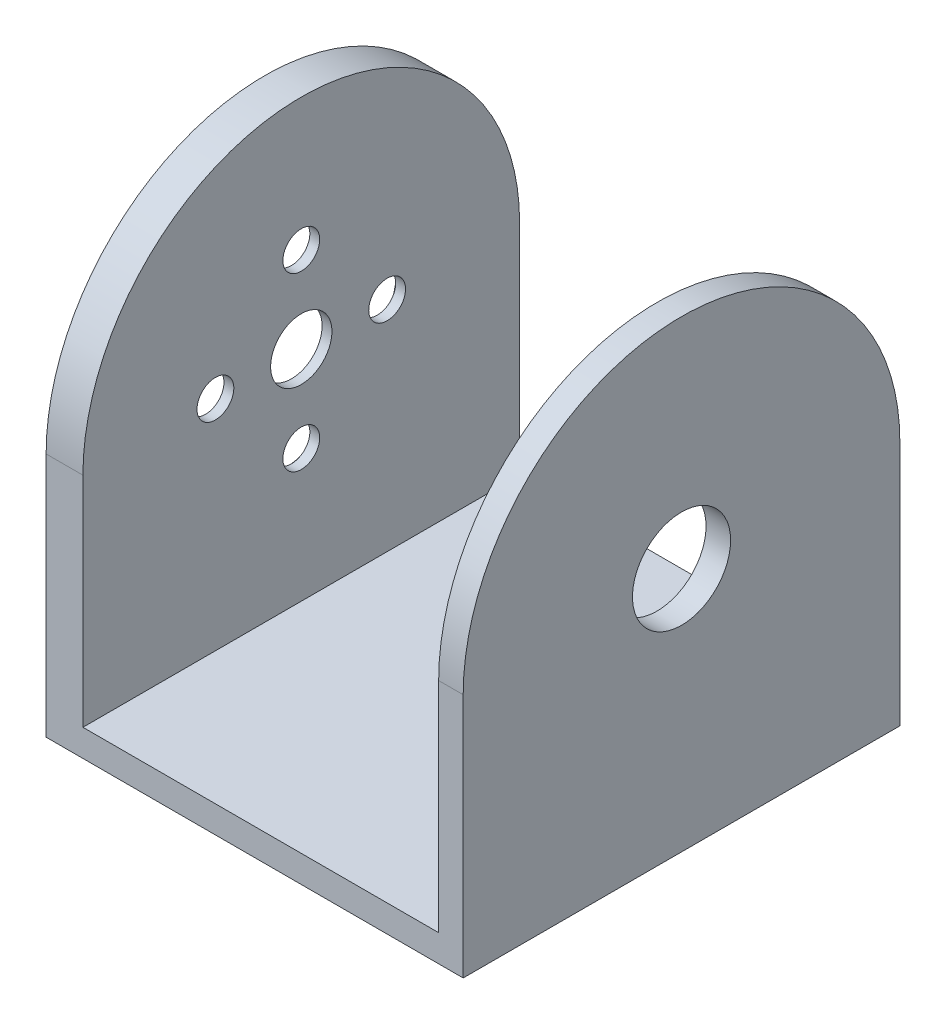
ISO-10303-21;
HEADER;
FILE_DESCRIPTION(('STEP AP214'),'2;1');
FILE_NAME('part.step','',(''),(''),'','','');
FILE_SCHEMA(('AUTOMOTIVE_DESIGN { 1 0 10303 214 1 1 1 1 }'));
ENDSEC;
DATA;
#1=APPLICATION_CONTEXT('core data for automotive mechanical design processes');
#2=APPLICATION_PROTOCOL_DEFINITION('international standard','automotive_design',2000,#1);
#3=PRODUCT_CONTEXT('',#1,'mechanical');
#4=PRODUCT('Part','Part','',(#3));
#5=PRODUCT_RELATED_PRODUCT_CATEGORY('part','',(#4));
#6=PRODUCT_DEFINITION_FORMATION('','',#4);
#7=PRODUCT_DEFINITION_CONTEXT('part definition',#1,'design');
#8=PRODUCT_DEFINITION('design','',#6,#7);
#9=PRODUCT_DEFINITION_SHAPE('','',#8);
#10=(LENGTH_UNIT() NAMED_UNIT(*) SI_UNIT(.MILLI.,.METRE.));
#11=(NAMED_UNIT(*) PLANE_ANGLE_UNIT() SI_UNIT($,.RADIAN.));
#12=(NAMED_UNIT(*) SI_UNIT($,.STERADIAN.) SOLID_ANGLE_UNIT());
#13=UNCERTAINTY_MEASURE_WITH_UNIT(LENGTH_MEASURE(1.E-05),#10,'distance_accuracy_value','');
#14=(GEOMETRIC_REPRESENTATION_CONTEXT(3) GLOBAL_UNCERTAINTY_ASSIGNED_CONTEXT((#13)) GLOBAL_UNIT_ASSIGNED_CONTEXT((#10,
#11,#12)) REPRESENTATION_CONTEXT('',''));
#15=CARTESIAN_POINT('',(0.,0.,0.));
#16=DIRECTION('',(0.,0.,1.));
#17=DIRECTION('',(1.,0.,0.));
#18=AXIS2_PLACEMENT_3D('',#15,#16,#17);
#19=CARTESIAN_POINT('',(-4.99999999999999,20.,0.));
#20=DIRECTION('',(-1.,0.,0.));
#21=DIRECTION('',(0.,0.,1.));
#22=AXIS2_PLACEMENT_3D('',#19,#20,#21);
#23=CYLINDRICAL_SURFACE('',#22,2.5);
#24=CARTESIAN_POINT('',(-14.,20.,0.));
#25=DIRECTION('',(-1.,0.,0.));
#26=DIRECTION('',(0.,0.,1.));
#27=AXIS2_PLACEMENT_3D('',#24,#25,#26);
#28=CIRCLE('',#27,2.5);
#29=CARTESIAN_POINT('',(-14.,20.,2.5));
#30=VERTEX_POINT('',#29);
#31=EDGE_CURVE('E205',#30,#30,#28,.T.);
#32=ORIENTED_EDGE('',*,*,#31,.F.);
#33=EDGE_LOOP('',(#32));
#34=FACE_BOUND('',#33,.T.);
#35=CARTESIAN_POINT('',(-14.8,20.,0.));
#36=DIRECTION('',(-1.,0.,0.));
#37=DIRECTION('',(0.,0.,1.));
#38=AXIS2_PLACEMENT_3D('',#35,#36,#37);
#39=CIRCLE('',#38,2.5);
#40=CARTESIAN_POINT('',(-14.8,20.,2.5));
#41=VERTEX_POINT('',#40);
#42=EDGE_CURVE('E240',#41,#41,#39,.T.);
#43=ORIENTED_EDGE('',*,*,#42,.T.);
#44=EDGE_LOOP('',(#43));
#45=FACE_BOUND('',#44,.T.);
#46=ADVANCED_FACE('F45',(#34,#45),#23,.F.);
#47=CARTESIAN_POINT('',(-4.99999999999999,13.,0.));
#48=DIRECTION('',(-1.,0.,0.));
#49=DIRECTION('',(0.,0.,1.));
#50=AXIS2_PLACEMENT_3D('',#47,#48,#49);
#51=CYLINDRICAL_SURFACE('',#50,1.5);
#52=CARTESIAN_POINT('',(-14.,13.,0.));
#53=DIRECTION('',(-1.,0.,0.));
#54=DIRECTION('',(0.,0.,1.));
#55=AXIS2_PLACEMENT_3D('',#52,#53,#54);
#56=CIRCLE('',#55,1.5);
#57=CARTESIAN_POINT('',(-14.,13.,1.5));
#58=VERTEX_POINT('',#57);
#59=EDGE_CURVE('E209',#58,#58,#56,.T.);
#60=ORIENTED_EDGE('',*,*,#59,.F.);
#61=EDGE_LOOP('',(#60));
#62=FACE_BOUND('',#61,.T.);
#63=CARTESIAN_POINT('',(-14.8,13.,0.));
#64=DIRECTION('',(-1.,0.,0.));
#65=DIRECTION('',(0.,0.,1.));
#66=AXIS2_PLACEMENT_3D('',#63,#64,#65);
#67=CIRCLE('',#66,1.5);
#68=CARTESIAN_POINT('',(-14.8,13.,1.5));
#69=VERTEX_POINT('',#68);
#70=EDGE_CURVE('E245',#69,#69,#67,.T.);
#71=ORIENTED_EDGE('',*,*,#70,.T.);
#72=EDGE_LOOP('',(#71));
#73=FACE_BOUND('',#72,.T.);
#74=ADVANCED_FACE('F297',(#62,#73),#51,.F.);
#75=CARTESIAN_POINT('',(-4.99999999999999,20.,-7.));
#76=DIRECTION('',(-1.,0.,0.));
#77=DIRECTION('',(0.,0.,1.));
#78=AXIS2_PLACEMENT_3D('',#75,#76,#77);
#79=CYLINDRICAL_SURFACE('',#78,1.5);
#80=CARTESIAN_POINT('',(-14.,20.,-7.));
#81=DIRECTION('',(-1.,0.,0.));
#82=DIRECTION('',(0.,0.,1.));
#83=AXIS2_PLACEMENT_3D('',#80,#81,#82);
#84=CIRCLE('',#83,1.5);
#85=CARTESIAN_POINT('',(-14.,20.,-5.5));
#86=VERTEX_POINT('',#85);
#87=EDGE_CURVE('E214',#86,#86,#84,.T.);
#88=ORIENTED_EDGE('',*,*,#87,.F.);
#89=EDGE_LOOP('',(#88));
#90=FACE_BOUND('',#89,.T.);
#91=CARTESIAN_POINT('',(-14.8,20.,-7.));
#92=DIRECTION('',(-1.,0.,0.));
#93=DIRECTION('',(0.,0.,1.));
#94=AXIS2_PLACEMENT_3D('',#91,#92,#93);
#95=CIRCLE('',#94,1.5);
#96=CARTESIAN_POINT('',(-14.8,20.,-5.5));
#97=VERTEX_POINT('',#96);
#98=EDGE_CURVE('E239',#97,#97,#95,.T.);
#99=ORIENTED_EDGE('',*,*,#98,.T.);
#100=EDGE_LOOP('',(#99));
#101=FACE_BOUND('',#100,.T.);
#102=ADVANCED_FACE('F303',(#90,#101),#79,.F.);
#103=CARTESIAN_POINT('',(-4.99999999999999,27.,0.));
#104=DIRECTION('',(-1.,0.,0.));
#105=DIRECTION('',(0.,0.,1.));
#106=AXIS2_PLACEMENT_3D('',#103,#104,#105);
#107=CYLINDRICAL_SURFACE('',#106,1.5);
#108=CARTESIAN_POINT('',(-14.,27.,0.));
#109=DIRECTION('',(-1.,0.,0.));
#110=DIRECTION('',(0.,0.,1.));
#111=AXIS2_PLACEMENT_3D('',#108,#109,#110);
#112=CIRCLE('',#111,1.5);
#113=CARTESIAN_POINT('',(-14.,27.,1.5));
#114=VERTEX_POINT('',#113);
#115=EDGE_CURVE('E218',#114,#114,#112,.T.);
#116=ORIENTED_EDGE('',*,*,#115,.F.);
#117=EDGE_LOOP('',(#116));
#118=FACE_BOUND('',#117,.T.);
#119=CARTESIAN_POINT('',(-14.8,27.,0.));
#120=DIRECTION('',(-1.,0.,0.));
#121=DIRECTION('',(0.,0.,1.));
#122=AXIS2_PLACEMENT_3D('',#119,#120,#121);
#123=CIRCLE('',#122,1.5);
#124=CARTESIAN_POINT('',(-14.8,27.,1.5));
#125=VERTEX_POINT('',#124);
#126=EDGE_CURVE('E254',#125,#125,#123,.T.);
#127=ORIENTED_EDGE('',*,*,#126,.T.);
#128=EDGE_LOOP('',(#127));
#129=FACE_BOUND('',#128,.T.);
#130=ADVANCED_FACE('F232',(#118,#129),#107,.F.);
#131=CARTESIAN_POINT('',(-4.99999999999999,20.,7.));
#132=DIRECTION('',(-1.,0.,0.));
#133=DIRECTION('',(0.,0.,1.));
#134=AXIS2_PLACEMENT_3D('',#131,#132,#133);
#135=CYLINDRICAL_SURFACE('',#134,1.5);
#136=CARTESIAN_POINT('',(-14.,20.,7.));
#137=DIRECTION('',(-1.,0.,0.));
#138=DIRECTION('',(0.,0.,1.));
#139=AXIS2_PLACEMENT_3D('',#136,#137,#138);
#140=CIRCLE('',#139,1.5);
#141=CARTESIAN_POINT('',(-14.,20.,8.5));
#142=VERTEX_POINT('',#141);
#143=EDGE_CURVE('E139',#142,#142,#140,.T.);
#144=ORIENTED_EDGE('',*,*,#143,.F.);
#145=EDGE_LOOP('',(#144));
#146=FACE_BOUND('',#145,.T.);
#147=CARTESIAN_POINT('',(-14.8,20.,7.));
#148=DIRECTION('',(-1.,0.,0.));
#149=DIRECTION('',(0.,0.,1.));
#150=AXIS2_PLACEMENT_3D('',#147,#148,#149);
#151=CIRCLE('',#150,1.5);
#152=CARTESIAN_POINT('',(-14.8,20.,8.5));
#153=VERTEX_POINT('',#152);
#154=EDGE_CURVE('E236',#153,#153,#151,.T.);
#155=ORIENTED_EDGE('',*,*,#154,.T.);
#156=EDGE_LOOP('',(#155));
#157=FACE_BOUND('',#156,.T.);
#158=ADVANCED_FACE('F228',(#146,#157),#135,.F.);
#159=CARTESIAN_POINT('',(0.,2.2,0.));
#160=DIRECTION('',(0.,-1.,0.));
#161=DIRECTION('',(0.,0.,-1.));
#162=AXIS2_PLACEMENT_3D('',#159,#160,#161);
#163=PLANE('',#162);
#164=DIRECTION('',(1.,0.,0.));
#165=VECTOR('',#164,1.);
#166=CARTESIAN_POINT('',(-17.,2.2,17.8));
#167=LINE('',#166,#165);
#168=CARTESIAN_POINT('',(-14.,2.2,17.8));
#169=VERTEX_POINT('',#168);
#170=CARTESIAN_POINT('',(15.,2.2,17.8));
#171=VERTEX_POINT('',#170);
#172=EDGE_CURVE('E68',#169,#171,#167,.T.);
#173=ORIENTED_EDGE('',*,*,#172,.T.);
#174=DIRECTION('',(0.,0.,-1.));
#175=VECTOR('',#174,1.);
#176=CARTESIAN_POINT('',(15.,2.2,17.8));
#177=LINE('',#176,#175);
#178=CARTESIAN_POINT('',(15.,2.2,-17.8));
#179=VERTEX_POINT('',#178);
#180=EDGE_CURVE('E63',#171,#179,#177,.T.);
#181=ORIENTED_EDGE('',*,*,#180,.T.);
#182=DIRECTION('',(-1.,0.,0.));
#183=VECTOR('',#182,1.);
#184=CARTESIAN_POINT('',(-17.,2.2,-17.8));
#185=LINE('',#184,#183);
#186=CARTESIAN_POINT('',(-14.,2.2,-17.8));
#187=VERTEX_POINT('',#186);
#188=EDGE_CURVE('E135',#179,#187,#185,.T.);
#189=ORIENTED_EDGE('',*,*,#188,.T.);
#190=DIRECTION('',(0.,0.,-1.));
#191=VECTOR('',#190,1.);
#192=CARTESIAN_POINT('',(-14.,2.2,0.));
#193=LINE('',#192,#191);
#194=EDGE_CURVE('E158',#169,#187,#193,.T.);
#195=ORIENTED_EDGE('',*,*,#194,.F.);
#196=EDGE_LOOP('',(#173,#181,#189,#195));
#197=FACE_BOUND('',#196,.T.);
#198=ADVANCED_FACE('F231',(#197),#163,.F.);
#199=CARTESIAN_POINT('',(17.,2.2,17.8));
#200=DIRECTION('',(-1.,0.,0.));
#201=DIRECTION('',(0.,0.,1.));
#202=AXIS2_PLACEMENT_3D('',#199,#200,#201);
#203=PLANE('',#202);
#204=CARTESIAN_POINT('',(17.,20.,0.));
#205=DIRECTION('',(1.,0.,0.));
#206=DIRECTION('',(0.,0.,-1.));
#207=AXIS2_PLACEMENT_3D('',#204,#205,#206);
#208=CIRCLE('',#207,4.);
#209=CARTESIAN_POINT('',(17.,20.,-4.));
#210=VERTEX_POINT('',#209);
#211=EDGE_CURVE('E508',#210,#210,#208,.T.);
#212=ORIENTED_EDGE('',*,*,#211,.F.);
#213=EDGE_LOOP('',(#212));
#214=FACE_BOUND('',#213,.T.);
#215=DIRECTION('',(0.,0.,-1.));
#216=VECTOR('',#215,1.);
#217=CARTESIAN_POINT('',(17.,0.,17.8));
#218=LINE('',#217,#216);
#219=CARTESIAN_POINT('',(17.,0.,17.8));
#220=VERTEX_POINT('',#219);
#221=CARTESIAN_POINT('',(17.,0.,-17.8));
#222=VERTEX_POINT('',#221);
#223=EDGE_CURVE('E174',#220,#222,#218,.T.);
#224=ORIENTED_EDGE('',*,*,#223,.T.);
#225=DIRECTION('',(0.,-1.,0.));
#226=VECTOR('',#225,1.);
#227=CARTESIAN_POINT('',(17.,2.2,-17.8));
#228=LINE('',#227,#226);
#229=CARTESIAN_POINT('',(17.,20.,-17.8));
#230=VERTEX_POINT('',#229);
#231=EDGE_CURVE('E11',#230,#222,#228,.T.);
#232=ORIENTED_EDGE('',*,*,#231,.F.);
#233=CARTESIAN_POINT('',(17.,20.,0.));
#234=DIRECTION('',(-1.,0.,0.));
#235=DIRECTION('',(0.,0.,1.));
#236=AXIS2_PLACEMENT_3D('',#233,#234,#235);
#237=CIRCLE('',#236,17.8);
#238=CARTESIAN_POINT('',(17.,20.,17.8));
#239=VERTEX_POINT('',#238);
#240=EDGE_CURVE('E128',#239,#230,#237,.T.);
#241=ORIENTED_EDGE('',*,*,#240,.F.);
#242=DIRECTION('',(0.,-1.,0.));
#243=VECTOR('',#242,1.);
#244=CARTESIAN_POINT('',(17.,2.2,17.8));
#245=LINE('',#244,#243);
#246=EDGE_CURVE('E183',#239,#220,#245,.T.);
#247=ORIENTED_EDGE('',*,*,#246,.T.);
#248=EDGE_LOOP('',(#224,#232,#241,#247));
#249=FACE_BOUND('',#248,.T.);
#250=ADVANCED_FACE('F47',(#214,#249),#203,.F.);
#251=CARTESIAN_POINT('',(-17.,2.2,-17.8));
#252=DIRECTION('',(0.,0.,1.));
#253=DIRECTION('',(1.,0.,0.));
#254=AXIS2_PLACEMENT_3D('',#251,#252,#253);
#255=PLANE('',#254);
#256=DIRECTION('',(-1.,0.,0.));
#257=VECTOR('',#256,1.);
#258=CARTESIAN_POINT('',(-17.,0.,-17.8));
#259=LINE('',#258,#257);
#260=CARTESIAN_POINT('',(-17.,0.,-17.8));
#261=VERTEX_POINT('',#260);
#262=EDGE_CURVE('E187',#222,#261,#259,.T.);
#263=ORIENTED_EDGE('',*,*,#262,.T.);
#264=DIRECTION('',(0.,-1.,0.));
#265=VECTOR('',#264,1.);
#266=CARTESIAN_POINT('',(-17.,2.2,-17.8));
#267=LINE('',#266,#265);
#268=CARTESIAN_POINT('',(-17.,20.,-17.8));
#269=VERTEX_POINT('',#268);
#270=EDGE_CURVE('E55',#269,#261,#267,.T.);
#271=ORIENTED_EDGE('',*,*,#270,.F.);
#272=DIRECTION('',(-1.,0.,0.));
#273=VECTOR('',#272,1.);
#274=CARTESIAN_POINT('',(-14.,20.,-17.8));
#275=LINE('',#274,#273);
#276=CARTESIAN_POINT('',(-14.,20.,-17.8));
#277=VERTEX_POINT('',#276);
#278=EDGE_CURVE('E166',#277,#269,#275,.T.);
#279=ORIENTED_EDGE('',*,*,#278,.F.);
#280=DIRECTION('',(0.,1.,0.));
#281=VECTOR('',#280,1.);
#282=CARTESIAN_POINT('',(-14.,0.,-17.8));
#283=LINE('',#282,#281);
#284=EDGE_CURVE('E155',#187,#277,#283,.T.);
#285=ORIENTED_EDGE('',*,*,#284,.F.);
#286=ORIENTED_EDGE('',*,*,#188,.F.);
#287=DIRECTION('',(0.,1.,0.));
#288=VECTOR('',#287,1.);
#289=CARTESIAN_POINT('',(15.,2.20000000000001,-17.8));
#290=LINE('',#289,#288);
#291=CARTESIAN_POINT('',(15.,20.,-17.8));
#292=VERTEX_POINT('',#291);
#293=EDGE_CURVE('E116',#179,#292,#290,.T.);
#294=ORIENTED_EDGE('',*,*,#293,.T.);
#295=DIRECTION('',(1.,0.,0.));
#296=VECTOR('',#295,1.);
#297=CARTESIAN_POINT('',(15.,20.,-17.8));
#298=LINE('',#297,#296);
#299=EDGE_CURVE('E125',#292,#230,#298,.T.);
#300=ORIENTED_EDGE('',*,*,#299,.T.);
#301=ORIENTED_EDGE('',*,*,#231,.T.);
#302=EDGE_LOOP('',(#263,#271,#279,#285,#286,#294,#300,#301));
#303=FACE_BOUND('',#302,.T.);
#304=ADVANCED_FACE('F133',(#303),#255,.F.);
#305=CARTESIAN_POINT('',(-17.,2.2,17.8));
#306=DIRECTION('',(1.,0.,0.));
#307=DIRECTION('',(0.,0.,-1.));
#308=AXIS2_PLACEMENT_3D('',#305,#306,#307);
#309=PLANE('',#308);
#310=CARTESIAN_POINT('',(-17.,20.,0.));
#311=DIRECTION('',(-1.,0.,0.));
#312=DIRECTION('',(0.,0.,1.));
#313=AXIS2_PLACEMENT_3D('',#310,#311,#312);
#314=CIRCLE('',#313,10.925);
#315=CARTESIAN_POINT('',(-17.,20.,10.925));
#316=VERTEX_POINT('',#315);
#317=EDGE_CURVE('E142',#316,#316,#314,.T.);
#318=ORIENTED_EDGE('',*,*,#317,.F.);
#319=EDGE_LOOP('',(#318));
#320=FACE_BOUND('',#319,.T.);
#321=DIRECTION('',(0.,0.,1.));
#322=VECTOR('',#321,1.);
#323=CARTESIAN_POINT('',(-17.,0.,17.8));
#324=LINE('',#323,#322);
#325=CARTESIAN_POINT('',(-17.,0.,17.8));
#326=VERTEX_POINT('',#325);
#327=EDGE_CURVE('E190',#261,#326,#324,.T.);
#328=ORIENTED_EDGE('',*,*,#327,.T.);
#329=DIRECTION('',(0.,-1.,0.));
#330=VECTOR('',#329,1.);
#331=CARTESIAN_POINT('',(-17.,2.2,17.8));
#332=LINE('',#331,#330);
#333=CARTESIAN_POINT('',(-17.,20.,17.8));
#334=VERTEX_POINT('',#333);
#335=EDGE_CURVE('E198',#334,#326,#332,.T.);
#336=ORIENTED_EDGE('',*,*,#335,.F.);
#337=CARTESIAN_POINT('',(-17.,20.,0.));
#338=DIRECTION('',(-1.,0.,0.));
#339=DIRECTION('',(0.,0.,1.));
#340=AXIS2_PLACEMENT_3D('',#337,#338,#339);
#341=CIRCLE('',#340,17.8);
#342=EDGE_CURVE('E150',#269,#334,#341,.F.);
#343=ORIENTED_EDGE('',*,*,#342,.F.);
#344=ORIENTED_EDGE('',*,*,#270,.T.);
#345=EDGE_LOOP('',(#328,#336,#343,#344));
#346=FACE_BOUND('',#345,.T.);
#347=ADVANCED_FACE('F267',(#320,#346),#309,.F.);
#348=CARTESIAN_POINT('',(-17.,2.2,17.8));
#349=DIRECTION('',(0.,0.,-1.));
#350=DIRECTION('',(-1.,0.,0.));
#351=AXIS2_PLACEMENT_3D('',#348,#349,#350);
#352=PLANE('',#351);
#353=DIRECTION('',(1.,0.,0.));
#354=VECTOR('',#353,1.);
#355=CARTESIAN_POINT('',(-17.,0.,17.8));
#356=LINE('',#355,#354);
#357=EDGE_CURVE('E180',#326,#220,#356,.T.);
#358=ORIENTED_EDGE('',*,*,#357,.T.);
#359=ORIENTED_EDGE('',*,*,#246,.F.);
#360=DIRECTION('',(1.,0.,0.));
#361=VECTOR('',#360,1.);
#362=CARTESIAN_POINT('',(15.,20.,17.8));
#363=LINE('',#362,#361);
#364=CARTESIAN_POINT('',(15.,20.,17.8));
#365=VERTEX_POINT('',#364);
#366=EDGE_CURVE('E131',#365,#239,#363,.T.);
#367=ORIENTED_EDGE('',*,*,#366,.F.);
#368=DIRECTION('',(0.,1.,0.));
#369=VECTOR('',#368,1.);
#370=CARTESIAN_POINT('',(15.,2.2,17.8));
#371=LINE('',#370,#369);
#372=EDGE_CURVE('E117',#171,#365,#371,.T.);
#373=ORIENTED_EDGE('',*,*,#372,.F.);
#374=ORIENTED_EDGE('',*,*,#172,.F.);
#375=DIRECTION('',(0.,1.,0.));
#376=VECTOR('',#375,1.);
#377=CARTESIAN_POINT('',(-14.,0.,17.8));
#378=LINE('',#377,#376);
#379=CARTESIAN_POINT('',(-14.,20.,17.8));
#380=VERTEX_POINT('',#379);
#381=EDGE_CURVE('E162',#169,#380,#378,.T.);
#382=ORIENTED_EDGE('',*,*,#381,.T.);
#383=DIRECTION('',(-1.,0.,0.));
#384=VECTOR('',#383,1.);
#385=CARTESIAN_POINT('',(-14.,20.,17.8));
#386=LINE('',#385,#384);
#387=EDGE_CURVE('E170',#380,#334,#386,.T.);
#388=ORIENTED_EDGE('',*,*,#387,.T.);
#389=ORIENTED_EDGE('',*,*,#335,.T.);
#390=EDGE_LOOP('',(#358,#359,#367,#373,#374,#382,#388,#389));
#391=FACE_BOUND('',#390,.T.);
#392=ADVANCED_FACE('F270',(#391),#352,.F.);
#393=CARTESIAN_POINT('',(0.,0.,0.));
#394=DIRECTION('',(0.,-1.,0.));
#395=DIRECTION('',(0.,0.,-1.));
#396=AXIS2_PLACEMENT_3D('',#393,#394,#395);
#397=PLANE('',#396);
#398=ORIENTED_EDGE('',*,*,#223,.F.);
#399=ORIENTED_EDGE('',*,*,#357,.F.);
#400=ORIENTED_EDGE('',*,*,#327,.F.);
#401=ORIENTED_EDGE('',*,*,#262,.F.);
#402=EDGE_LOOP('',(#398,#399,#400,#401));
#403=FACE_BOUND('',#402,.T.);
#404=ADVANCED_FACE('F279',(#403),#397,.T.);
#405=CARTESIAN_POINT('',(-14.,20.,0.));
#406=DIRECTION('',(-1.,0.,0.));
#407=DIRECTION('',(0.,0.,1.));
#408=AXIS2_PLACEMENT_3D('',#405,#406,#407);
#409=CYLINDRICAL_SURFACE('',#408,17.8);
#410=ORIENTED_EDGE('',*,*,#342,.T.);
#411=ORIENTED_EDGE('',*,*,#387,.F.);
#412=CARTESIAN_POINT('',(-14.,20.,0.));
#413=DIRECTION('',(-1.,0.,0.));
#414=DIRECTION('',(0.,0.,1.));
#415=AXIS2_PLACEMENT_3D('',#412,#413,#414);
#416=CIRCLE('',#415,17.8);
#417=EDGE_CURVE('E152',#277,#380,#416,.F.);
#418=ORIENTED_EDGE('',*,*,#417,.F.);
#419=ORIENTED_EDGE('',*,*,#278,.T.);
#420=EDGE_LOOP('',(#410,#411,#418,#419));
#421=FACE_BOUND('',#420,.T.);
#422=ADVANCED_FACE('F286',(#421),#409,.T.);
#423=CARTESIAN_POINT('',(-14.,0.,0.));
#424=DIRECTION('',(-1.,0.,0.));
#425=DIRECTION('',(0.,0.,1.));
#426=AXIS2_PLACEMENT_3D('',#423,#424,#425);
#427=PLANE('',#426);
#428=ORIENTED_EDGE('',*,*,#143,.T.);
#429=EDGE_LOOP('',(#428));
#430=FACE_BOUND('',#429,.T.);
#431=ORIENTED_EDGE('',*,*,#115,.T.);
#432=EDGE_LOOP('',(#431));
#433=FACE_BOUND('',#432,.T.);
#434=ORIENTED_EDGE('',*,*,#87,.T.);
#435=EDGE_LOOP('',(#434));
#436=FACE_BOUND('',#435,.T.);
#437=ORIENTED_EDGE('',*,*,#59,.T.);
#438=EDGE_LOOP('',(#437));
#439=FACE_BOUND('',#438,.T.);
#440=ORIENTED_EDGE('',*,*,#31,.T.);
#441=EDGE_LOOP('',(#440));
#442=FACE_BOUND('',#441,.T.);
#443=ORIENTED_EDGE('',*,*,#417,.T.);
#444=ORIENTED_EDGE('',*,*,#381,.F.);
#445=ORIENTED_EDGE('',*,*,#194,.T.);
#446=ORIENTED_EDGE('',*,*,#284,.T.);
#447=EDGE_LOOP('',(#443,#444,#445,#446));
#448=FACE_BOUND('',#447,.T.);
#449=ADVANCED_FACE('F225',(#430,#433,#436,#439,#442,#448),#427,.F.);
#450=CARTESIAN_POINT('',(15.,20.,0.));
#451=DIRECTION('',(1.,0.,0.));
#452=DIRECTION('',(0.,0.,-1.));
#453=AXIS2_PLACEMENT_3D('',#450,#451,#452);
#454=CYLINDRICAL_SURFACE('',#453,17.8);
#455=ORIENTED_EDGE('',*,*,#240,.T.);
#456=ORIENTED_EDGE('',*,*,#299,.F.);
#457=CARTESIAN_POINT('',(15.,20.,0.));
#458=DIRECTION('',(-1.,0.,0.));
#459=DIRECTION('',(0.,0.,1.));
#460=AXIS2_PLACEMENT_3D('',#457,#458,#459);
#461=CIRCLE('',#460,17.8);
#462=EDGE_CURVE('E112',#365,#292,#461,.T.);
#463=ORIENTED_EDGE('',*,*,#462,.F.);
#464=ORIENTED_EDGE('',*,*,#366,.T.);
#465=EDGE_LOOP('',(#455,#456,#463,#464));
#466=FACE_BOUND('',#465,.T.);
#467=ADVANCED_FACE('F126',(#466),#454,.T.);
#468=CARTESIAN_POINT('',(15.,20.,0.));
#469=DIRECTION('',(-1.,0.,0.));
#470=DIRECTION('',(0.,0.,1.));
#471=AXIS2_PLACEMENT_3D('',#468,#469,#470);
#472=PLANE('',#471);
#473=CARTESIAN_POINT('',(15.,20.,0.));
#474=DIRECTION('',(-1.,0.,0.));
#475=DIRECTION('',(0.,0.,1.));
#476=AXIS2_PLACEMENT_3D('',#473,#474,#475);
#477=CIRCLE('',#476,4.);
#478=CARTESIAN_POINT('',(15.,20.,-4.));
#479=VERTEX_POINT('',#478);
#480=EDGE_CURVE('E49',#479,#479,#477,.T.);
#481=ORIENTED_EDGE('',*,*,#480,.F.);
#482=EDGE_LOOP('',(#481));
#483=FACE_BOUND('',#482,.T.);
#484=ORIENTED_EDGE('',*,*,#293,.F.);
#485=ORIENTED_EDGE('',*,*,#180,.F.);
#486=ORIENTED_EDGE('',*,*,#372,.T.);
#487=ORIENTED_EDGE('',*,*,#462,.T.);
#488=EDGE_LOOP('',(#484,#485,#486,#487));
#489=FACE_BOUND('',#488,.T.);
#490=ADVANCED_FACE('F114',(#483,#489),#472,.T.);
#491=CARTESIAN_POINT('',(-14.8,20.,0.));
#492=DIRECTION('',(-1.,0.,0.));
#493=DIRECTION('',(0.,0.,1.));
#494=AXIS2_PLACEMENT_3D('',#491,#492,#493);
#495=CYLINDRICAL_SURFACE('',#494,10.925);
#496=CARTESIAN_POINT('',(-14.8,20.,0.));
#497=DIRECTION('',(-1.,0.,0.));
#498=DIRECTION('',(0.,0.,1.));
#499=AXIS2_PLACEMENT_3D('',#496,#497,#498);
#500=CIRCLE('',#499,10.925);
#501=CARTESIAN_POINT('',(-14.8,20.,10.925));
#502=VERTEX_POINT('',#501);
#503=EDGE_CURVE('E210',#502,#502,#500,.T.);
#504=ORIENTED_EDGE('',*,*,#503,.F.);
#505=EDGE_LOOP('',(#504));
#506=FACE_BOUND('',#505,.T.);
#507=ORIENTED_EDGE('',*,*,#317,.T.);
#508=EDGE_LOOP('',(#507));
#509=FACE_BOUND('',#508,.T.);
#510=ADVANCED_FACE('F265',(#506,#509),#495,.F.);
#511=CARTESIAN_POINT('',(-14.8,20.,0.));
#512=DIRECTION('',(-1.,0.,0.));
#513=DIRECTION('',(0.,0.,1.));
#514=AXIS2_PLACEMENT_3D('',#511,#512,#513);
#515=PLANE('',#514);
#516=ORIENTED_EDGE('',*,*,#42,.F.);
#517=EDGE_LOOP('',(#516));
#518=FACE_BOUND('',#517,.T.);
#519=ORIENTED_EDGE('',*,*,#154,.F.);
#520=EDGE_LOOP('',(#519));
#521=FACE_BOUND('',#520,.T.);
#522=ORIENTED_EDGE('',*,*,#98,.F.);
#523=EDGE_LOOP('',(#522));
#524=FACE_BOUND('',#523,.T.);
#525=ORIENTED_EDGE('',*,*,#70,.F.);
#526=EDGE_LOOP('',(#525));
#527=FACE_BOUND('',#526,.T.);
#528=ORIENTED_EDGE('',*,*,#126,.F.);
#529=EDGE_LOOP('',(#528));
#530=FACE_BOUND('',#529,.T.);
#531=ORIENTED_EDGE('',*,*,#503,.T.);
#532=EDGE_LOOP('',(#531));
#533=FACE_BOUND('',#532,.T.);
#534=ADVANCED_FACE('F331',(#518,#521,#524,#527,#530,#533),#515,.T.);
#535=CARTESIAN_POINT('',(4.80000000000001,20.,0.));
#536=DIRECTION('',(1.,0.,0.));
#537=DIRECTION('',(0.,0.,-1.));
#538=AXIS2_PLACEMENT_3D('',#535,#536,#537);
#539=CYLINDRICAL_SURFACE('',#538,4.);
#540=CARTESIAN_POINT('',(15.,20.,-4.));
#541=CARTESIAN_POINT('',(15.0208333333333,20.,-4.));
#542=CARTESIAN_POINT('',(15.0416666666667,20.,-4.));
#543=CARTESIAN_POINT('',(15.0833333333333,20.,-4.));
#544=CARTESIAN_POINT('',(15.1041666666667,20.,-4.));
#545=CARTESIAN_POINT('',(15.1458333333333,20.,-4.));
#546=CARTESIAN_POINT('',(15.1666666666667,20.,-4.));
#547=CARTESIAN_POINT('',(15.2083333333333,20.,-4.));
#548=CARTESIAN_POINT('',(15.2291666666667,20.,-4.));
#549=CARTESIAN_POINT('',(15.2708333333333,20.,-4.));
#550=CARTESIAN_POINT('',(15.2916666666667,20.,-4.));
#551=CARTESIAN_POINT('',(15.3333333333333,20.,-4.));
#552=CARTESIAN_POINT('',(15.3541666666667,20.,-4.));
#553=CARTESIAN_POINT('',(15.3958333333333,20.,-4.));
#554=CARTESIAN_POINT('',(15.4166666666667,20.,-4.));
#555=CARTESIAN_POINT('',(15.4583333333333,20.,-4.));
#556=CARTESIAN_POINT('',(15.4791666666667,20.,-4.));
#557=CARTESIAN_POINT('',(15.5208333333333,20.,-4.));
#558=CARTESIAN_POINT('',(15.5416666666667,20.,-4.));
#559=CARTESIAN_POINT('',(15.5833333333333,20.,-4.));
#560=CARTESIAN_POINT('',(15.6041666666667,20.,-4.));
#561=CARTESIAN_POINT('',(15.6458333333333,20.,-4.));
#562=CARTESIAN_POINT('',(15.6666666666667,20.,-4.));
#563=CARTESIAN_POINT('',(15.7083333333333,20.,-4.));
#564=CARTESIAN_POINT('',(15.7291666666667,20.,-4.));
#565=CARTESIAN_POINT('',(15.7708333333333,20.,-4.));
#566=CARTESIAN_POINT('',(15.7916666666667,20.,-4.));
#567=CARTESIAN_POINT('',(15.8333333333333,20.,-4.));
#568=CARTESIAN_POINT('',(15.8541666666667,20.,-4.));
#569=CARTESIAN_POINT('',(15.8958333333333,20.,-4.));
#570=CARTESIAN_POINT('',(15.9166666666667,20.,-4.));
#571=CARTESIAN_POINT('',(15.9583333333333,20.,-4.));
#572=CARTESIAN_POINT('',(15.9791666666667,20.,-4.));
#573=CARTESIAN_POINT('',(16.0208333333333,20.,-4.));
#574=CARTESIAN_POINT('',(16.0416666666667,20.,-4.));
#575=CARTESIAN_POINT('',(16.0833333333333,20.,-4.));
#576=CARTESIAN_POINT('',(16.1041666666667,20.,-4.));
#577=CARTESIAN_POINT('',(16.1458333333333,20.,-4.));
#578=CARTESIAN_POINT('',(16.1666666666667,20.,-4.));
#579=CARTESIAN_POINT('',(16.2083333333333,20.,-4.));
#580=CARTESIAN_POINT('',(16.2291666666667,20.,-4.));
#581=CARTESIAN_POINT('',(16.2708333333333,20.,-4.));
#582=CARTESIAN_POINT('',(16.2916666666667,20.,-4.));
#583=CARTESIAN_POINT('',(16.3333333333333,20.,-4.));
#584=CARTESIAN_POINT('',(16.3541666666667,20.,-4.));
#585=CARTESIAN_POINT('',(16.3958333333333,20.,-4.));
#586=CARTESIAN_POINT('',(16.4166666666667,20.,-4.));
#587=CARTESIAN_POINT('',(16.4583333333333,20.,-4.));
#588=CARTESIAN_POINT('',(16.4791666666667,20.,-4.));
#589=CARTESIAN_POINT('',(16.5208333333333,20.,-4.));
#590=CARTESIAN_POINT('',(16.5416666666667,20.,-4.));
#591=CARTESIAN_POINT('',(16.5833333333333,20.,-4.));
#592=CARTESIAN_POINT('',(16.6041666666667,20.,-4.));
#593=CARTESIAN_POINT('',(16.6458333333333,20.,-4.));
#594=CARTESIAN_POINT('',(16.6666666666667,20.,-4.));
#595=CARTESIAN_POINT('',(16.7083333333333,20.,-4.));
#596=CARTESIAN_POINT('',(16.7291666666667,20.,-4.));
#597=CARTESIAN_POINT('',(16.7708333333333,20.,-4.));
#598=CARTESIAN_POINT('',(16.7916666666667,20.,-4.));
#599=CARTESIAN_POINT('',(16.8333333333333,20.,-4.));
#600=CARTESIAN_POINT('',(16.8541666666667,20.,-4.));
#601=CARTESIAN_POINT('',(16.8958333333333,20.,-4.));
#602=CARTESIAN_POINT('',(16.9166666666667,20.,-4.));
#603=CARTESIAN_POINT('',(16.9583333333333,20.,-4.));
#604=CARTESIAN_POINT('',(16.9791666666667,20.,-4.));
#605=CARTESIAN_POINT('',(17.,20.,-4.));
#606=B_SPLINE_CURVE_WITH_KNOTS('',3,(#540,#541,#542,#543,#544,#545,#546,#547,#548,#549,#550,
#551,#552,#553,#554,#555,#556,#557,#558,#559,#560,#561,#562,#563,#564,#565,#566,#567,#568,#569,
#570,#571,#572,#573,#574,#575,#576,#577,#578,#579,#580,#581,#582,#583,#584,#585,#586,#587,#588,
#589,#590,#591,#592,#593,#594,#595,#596,#597,#598,#599,#600,#601,#602,#603,#604,#605),
.UNSPECIFIED.,.F.,.F.,(4,2,2,2,2,2,2,2,2,2,2,2,2,2,2,2,2,2,2,2,2,2,2,2,2,2,2,2,2,2,2,2,4),(0.,
0.0625000000000001,0.125,0.1875,0.25,0.312499999999999,0.374999999999999,0.437499999999999,
0.499999999999999,0.562499999999999,0.624999999999997,0.687499999999997,0.749999999999997,
0.812499999999997,0.874999999999997,0.937499999999997,0.999999999999997,1.0625,1.125,1.1875,
1.25,1.3125,1.375,1.4375,1.5,1.5625,1.625,1.6875,1.74999999999999,1.81249999999999,
1.87499999999999,1.93749999999999,1.99999999999999),.UNSPECIFIED.);
#607=EDGE_CURVE('BSEAM340',#479,#210,#606,.T.);
#608=ORIENTED_EDGE('',*,*,#480,.T.);
#609=ORIENTED_EDGE('',*,*,#211,.T.);
#610=ORIENTED_EDGE('',*,*,#607,.T.);
#611=ORIENTED_EDGE('',*,*,#607,.F.);
#612=EDGE_LOOP('',(#608,#610,#609,#611));
#613=FACE_BOUND('',#612,.T.);
#614=ADVANCED_FACE('F340',(#613),#539,.F.);
#615=CLOSED_SHELL('',(#46,#74,#102,#130,#158,#198,#250,#304,#347,#392,#404,#422,#449,#467,#490,
#510,#534,#614));
#616=MANIFOLD_SOLID_BREP('B2',#615);
#617=ADVANCED_BREP_SHAPE_REPRESENTATION('',(#18,#616),#14);
#618=SHAPE_DEFINITION_REPRESENTATION(#9,#617);
ENDSEC;
END-ISO-10303-21;
